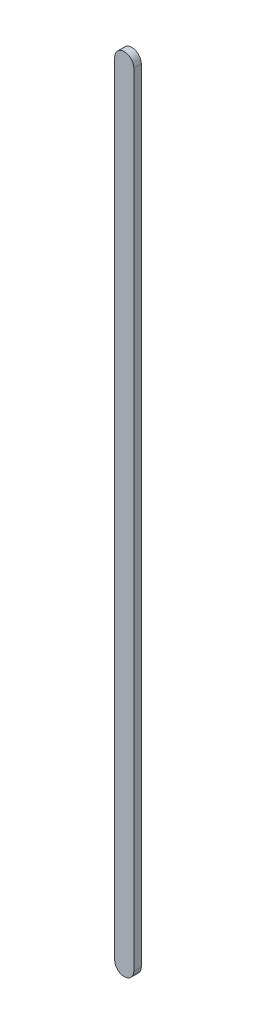
ISO-10303-21;
HEADER;
FILE_DESCRIPTION(('STEP AP214'),'2;1');
FILE_NAME('part.step','',(''),(''),'','','');
FILE_SCHEMA(('AUTOMOTIVE_DESIGN { 1 0 10303 214 1 1 1 1 }'));
ENDSEC;
DATA;
#1=APPLICATION_CONTEXT('core data for automotive mechanical design processes');
#2=APPLICATION_PROTOCOL_DEFINITION('international standard','automotive_design',2000,#1);
#3=PRODUCT_CONTEXT('',#1,'mechanical');
#4=PRODUCT('Part','Part','',(#3));
#5=PRODUCT_RELATED_PRODUCT_CATEGORY('part','',(#4));
#6=PRODUCT_DEFINITION_FORMATION('','',#4);
#7=PRODUCT_DEFINITION_CONTEXT('part definition',#1,'design');
#8=PRODUCT_DEFINITION('design','',#6,#7);
#9=PRODUCT_DEFINITION_SHAPE('','',#8);
#10=(LENGTH_UNIT() NAMED_UNIT(*) SI_UNIT(.MILLI.,.METRE.));
#11=(NAMED_UNIT(*) PLANE_ANGLE_UNIT() SI_UNIT($,.RADIAN.));
#12=(NAMED_UNIT(*) SI_UNIT($,.STERADIAN.) SOLID_ANGLE_UNIT());
#13=UNCERTAINTY_MEASURE_WITH_UNIT(LENGTH_MEASURE(1.E-05),#10,'distance_accuracy_value','');
#14=(GEOMETRIC_REPRESENTATION_CONTEXT(3) GLOBAL_UNCERTAINTY_ASSIGNED_CONTEXT((#13)) GLOBAL_UNIT_ASSIGNED_CONTEXT((#10,
#11,#12)) REPRESENTATION_CONTEXT('',''));
#15=CARTESIAN_POINT('',(0.,0.,0.));
#16=DIRECTION('',(0.,0.,1.));
#17=DIRECTION('',(1.,0.,0.));
#18=AXIS2_PLACEMENT_3D('',#15,#16,#17);
#19=CARTESIAN_POINT('',(88.646,65.532,0.));
#20=DIRECTION('',(-1.,0.,0.));
#21=DIRECTION('',(0.,1.,0.));
#22=AXIS2_PLACEMENT_3D('',#19,#20,#21);
#23=PLANE('',#22);
#24=DIRECTION('',(0.,1.,0.));
#25=VECTOR('',#24,1.);
#26=CARTESIAN_POINT('',(88.646,65.532,0.1999996));
#27=LINE('',#26,#25);
#28=CARTESIAN_POINT('',(88.646,65.532,0.1999996));
#29=VERTEX_POINT('',#28);
#30=CARTESIAN_POINT('',(88.646,86.36,0.1999996));
#31=VERTEX_POINT('',#30);
#32=EDGE_CURVE('E11',#29,#31,#27,.T.);
#33=ORIENTED_EDGE('',*,*,#32,.F.);
#34=DIRECTION('',(0.,0.,1.));
#35=VECTOR('',#34,1.);
#36=CARTESIAN_POINT('',(88.646,65.532,0.));
#37=LINE('',#36,#35);
#38=CARTESIAN_POINT('',(88.646,65.532,0.));
#39=VERTEX_POINT('',#38);
#40=EDGE_CURVE('E24',#39,#29,#37,.T.);
#41=ORIENTED_EDGE('',*,*,#40,.F.);
#42=DIRECTION('',(0.,1.,0.));
#43=VECTOR('',#42,1.);
#44=CARTESIAN_POINT('',(88.646,65.532,0.));
#45=LINE('',#44,#43);
#46=CARTESIAN_POINT('',(88.646,86.36,0.));
#47=VERTEX_POINT('',#46);
#48=EDGE_CURVE('E75',#39,#47,#45,.T.);
#49=ORIENTED_EDGE('',*,*,#48,.T.);
#50=DIRECTION('',(0.,0.,1.));
#51=VECTOR('',#50,1.);
#52=CARTESIAN_POINT('',(88.646,86.36,0.));
#53=LINE('',#52,#51);
#54=EDGE_CURVE('E37',#47,#31,#53,.T.);
#55=ORIENTED_EDGE('',*,*,#54,.T.);
#56=EDGE_LOOP('',(#33,#41,#49,#55));
#57=FACE_BOUND('',#56,.T.);
#58=ADVANCED_FACE('F17',(#57),#23,.F.);
#59=CARTESIAN_POINT('',(88.392,86.36,0.));
#60=DIRECTION('',(0.,0.,-1.));
#61=DIRECTION('',(1.,0.,0.));
#62=AXIS2_PLACEMENT_3D('',#59,#60,#61);
#63=CYLINDRICAL_SURFACE('',#62,0.254);
#64=CARTESIAN_POINT('',(88.392,86.36,0.1999996));
#65=DIRECTION('',(0.,0.,1.));
#66=DIRECTION('',(1.,0.,0.));
#67=AXIS2_PLACEMENT_3D('',#64,#65,#66);
#68=CIRCLE('',#67,0.254);
#69=CARTESIAN_POINT('',(88.138,86.36,0.1999996));
#70=VERTEX_POINT('',#69);
#71=EDGE_CURVE('E83',#31,#70,#68,.T.);
#72=ORIENTED_EDGE('',*,*,#71,.F.);
#73=ORIENTED_EDGE('',*,*,#54,.F.);
#74=CARTESIAN_POINT('',(88.392,86.36,0.));
#75=DIRECTION('',(0.,0.,1.));
#76=DIRECTION('',(1.,0.,0.));
#77=AXIS2_PLACEMENT_3D('',#74,#75,#76);
#78=CIRCLE('',#77,0.254);
#79=CARTESIAN_POINT('',(88.138,86.36,0.));
#80=VERTEX_POINT('',#79);
#81=EDGE_CURVE('E81',#47,#80,#78,.T.);
#82=ORIENTED_EDGE('',*,*,#81,.T.);
#83=DIRECTION('',(0.,0.,1.));
#84=VECTOR('',#83,1.);
#85=CARTESIAN_POINT('',(88.138,86.36,0.));
#86=LINE('',#85,#84);
#87=EDGE_CURVE('E67',#80,#70,#86,.T.);
#88=ORIENTED_EDGE('',*,*,#87,.T.);
#89=EDGE_LOOP('',(#72,#73,#82,#88));
#90=FACE_BOUND('',#89,.T.);
#91=ADVANCED_FACE('F89',(#90),#63,.T.);
#92=CARTESIAN_POINT('',(88.138,86.36,0.));
#93=DIRECTION('',(1.,0.,0.));
#94=DIRECTION('',(0.,-1.,0.));
#95=AXIS2_PLACEMENT_3D('',#92,#93,#94);
#96=PLANE('',#95);
#97=DIRECTION('',(0.,-1.,0.));
#98=VECTOR('',#97,1.);
#99=CARTESIAN_POINT('',(88.138,86.36,0.1999996));
#100=LINE('',#99,#98);
#101=CARTESIAN_POINT('',(88.138,65.532,0.1999996));
#102=VERTEX_POINT('',#101);
#103=EDGE_CURVE('E71',#70,#102,#100,.T.);
#104=ORIENTED_EDGE('',*,*,#103,.F.);
#105=ORIENTED_EDGE('',*,*,#87,.F.);
#106=DIRECTION('',(0.,-1.,0.));
#107=VECTOR('',#106,1.);
#108=CARTESIAN_POINT('',(88.138,86.36,0.));
#109=LINE('',#108,#107);
#110=CARTESIAN_POINT('',(88.138,65.532,0.));
#111=VERTEX_POINT('',#110);
#112=EDGE_CURVE('E63',#80,#111,#109,.T.);
#113=ORIENTED_EDGE('',*,*,#112,.T.);
#114=DIRECTION('',(0.,0.,1.));
#115=VECTOR('',#114,1.);
#116=CARTESIAN_POINT('',(88.138,65.532,0.));
#117=LINE('',#116,#115);
#118=EDGE_CURVE('E53',#111,#102,#117,.T.);
#119=ORIENTED_EDGE('',*,*,#118,.T.);
#120=EDGE_LOOP('',(#104,#105,#113,#119));
#121=FACE_BOUND('',#120,.T.);
#122=ADVANCED_FACE('F66',(#121),#96,.F.);
#123=CARTESIAN_POINT('',(88.392,65.532,0.));
#124=DIRECTION('',(0.,0.,-1.));
#125=DIRECTION('',(-1.,0.,0.));
#126=AXIS2_PLACEMENT_3D('',#123,#124,#125);
#127=CYLINDRICAL_SURFACE('',#126,0.254);
#128=CARTESIAN_POINT('',(88.392,65.532,0.1999996));
#129=DIRECTION('',(0.,0.,1.));
#130=DIRECTION('',(-1.,0.,0.));
#131=AXIS2_PLACEMENT_3D('',#128,#129,#130);
#132=CIRCLE('',#131,0.254);
#133=EDGE_CURVE('E59',#102,#29,#132,.T.);
#134=ORIENTED_EDGE('',*,*,#133,.F.);
#135=ORIENTED_EDGE('',*,*,#118,.F.);
#136=CARTESIAN_POINT('',(88.392,65.532,0.));
#137=DIRECTION('',(0.,0.,1.));
#138=DIRECTION('',(-1.,0.,0.));
#139=AXIS2_PLACEMENT_3D('',#136,#137,#138);
#140=CIRCLE('',#139,0.254);
#141=EDGE_CURVE('E57',#111,#39,#140,.T.);
#142=ORIENTED_EDGE('',*,*,#141,.T.);
#143=ORIENTED_EDGE('',*,*,#40,.T.);
#144=EDGE_LOOP('',(#134,#135,#142,#143));
#145=FACE_BOUND('',#144,.T.);
#146=ADVANCED_FACE('F55',(#145),#127,.T.);
#147=CARTESIAN_POINT('',(88.646,65.532,0.));
#148=DIRECTION('',(0.,0.,-1.));
#149=DIRECTION('',(-1.,0.,0.));
#150=AXIS2_PLACEMENT_3D('',#147,#148,#149);
#151=PLANE('',#150);
#152=ORIENTED_EDGE('',*,*,#141,.F.);
#153=ORIENTED_EDGE('',*,*,#112,.F.);
#154=ORIENTED_EDGE('',*,*,#81,.F.);
#155=ORIENTED_EDGE('',*,*,#48,.F.);
#156=EDGE_LOOP('',(#152,#153,#154,#155));
#157=FACE_BOUND('',#156,.T.);
#158=ADVANCED_FACE('F74',(#157),#151,.T.);
#159=CARTESIAN_POINT('',(88.646,65.532,0.1999996));
#160=DIRECTION('',(0.,0.,-1.));
#161=DIRECTION('',(-1.,0.,0.));
#162=AXIS2_PLACEMENT_3D('',#159,#160,#161);
#163=PLANE('',#162);
#164=ORIENTED_EDGE('',*,*,#32,.T.);
#165=ORIENTED_EDGE('',*,*,#71,.T.);
#166=ORIENTED_EDGE('',*,*,#103,.T.);
#167=ORIENTED_EDGE('',*,*,#133,.T.);
#168=EDGE_LOOP('',(#164,#165,#166,#167));
#169=FACE_BOUND('',#168,.T.);
#170=ADVANCED_FACE('F91',(#169),#163,.F.);
#171=CLOSED_SHELL('',(#58,#91,#122,#146,#158,#170));
#172=MANIFOLD_SOLID_BREP('B1',#171);
#173=ADVANCED_BREP_SHAPE_REPRESENTATION('',(#18,#172),#14);
#174=SHAPE_DEFINITION_REPRESENTATION(#9,#173);
ENDSEC;
END-ISO-10303-21;
